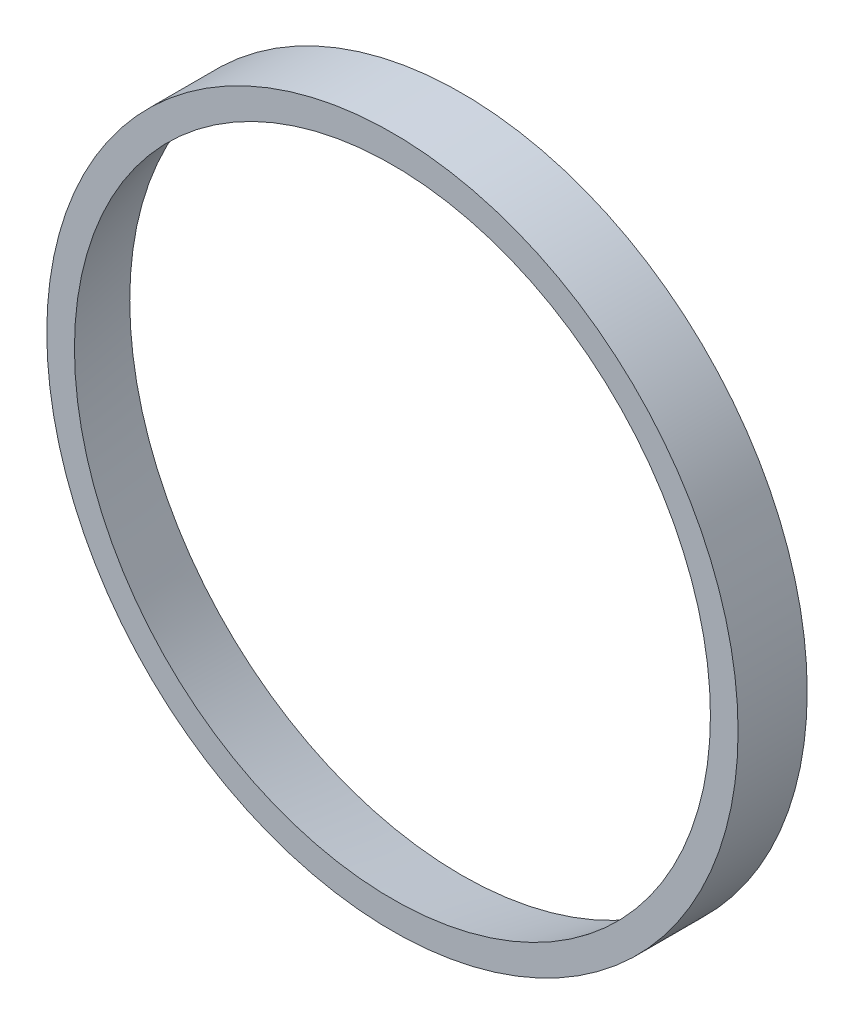
ISO-10303-21;
HEADER;
FILE_DESCRIPTION(('STEP AP214'),'2;1');
FILE_NAME('part.step','',(''),(''),'','','');
FILE_SCHEMA(('AUTOMOTIVE_DESIGN { 1 0 10303 214 1 1 1 1 }'));
ENDSEC;
DATA;
#1=APPLICATION_CONTEXT('core data for automotive mechanical design processes');
#2=APPLICATION_PROTOCOL_DEFINITION('international standard','automotive_design',2000,#1);
#3=PRODUCT_CONTEXT('',#1,'mechanical');
#4=PRODUCT('Part','Part','',(#3));
#5=PRODUCT_RELATED_PRODUCT_CATEGORY('part','',(#4));
#6=PRODUCT_DEFINITION_FORMATION('','',#4);
#7=PRODUCT_DEFINITION_CONTEXT('part definition',#1,'design');
#8=PRODUCT_DEFINITION('design','',#6,#7);
#9=PRODUCT_DEFINITION_SHAPE('','',#8);
#10=(LENGTH_UNIT() NAMED_UNIT(*) SI_UNIT(.MILLI.,.METRE.));
#11=(NAMED_UNIT(*) PLANE_ANGLE_UNIT() SI_UNIT($,.RADIAN.));
#12=(NAMED_UNIT(*) SI_UNIT($,.STERADIAN.) SOLID_ANGLE_UNIT());
#13=UNCERTAINTY_MEASURE_WITH_UNIT(LENGTH_MEASURE(1.E-05),#10,'distance_accuracy_value','');
#14=(GEOMETRIC_REPRESENTATION_CONTEXT(3) GLOBAL_UNCERTAINTY_ASSIGNED_CONTEXT((#13)) GLOBAL_UNIT_ASSIGNED_CONTEXT((#10,
#11,#12)) REPRESENTATION_CONTEXT('',''));
#15=CARTESIAN_POINT('',(0.,0.,0.));
#16=DIRECTION('',(0.,0.,1.));
#17=DIRECTION('',(1.,0.,0.));
#18=AXIS2_PLACEMENT_3D('',#15,#16,#17);
#19=CARTESIAN_POINT('',(14.605,0.,0.));
#20=DIRECTION('',(0.,0.,1.));
#21=DIRECTION('',(1.,0.,0.));
#22=AXIS2_PLACEMENT_3D('',#19,#20,#21);
#23=PLANE('',#22);
#24=CARTESIAN_POINT('',(0.,0.,0.));
#25=DIRECTION('',(0.,0.,1.));
#26=DIRECTION('',(1.,0.,0.));
#27=AXIS2_PLACEMENT_3D('',#24,#25,#26);
#28=CIRCLE('',#27,15.875);
#29=CARTESIAN_POINT('',(15.875,0.,0.));
#30=VERTEX_POINT('',#29);
#31=EDGE_CURVE('E10',#30,#30,#28,.T.);
#32=ORIENTED_EDGE('',*,*,#31,.T.);
#33=EDGE_LOOP('',(#32));
#34=FACE_BOUND('',#33,.T.);
#35=CARTESIAN_POINT('',(0.,0.,0.));
#36=DIRECTION('',(0.,0.,1.));
#37=DIRECTION('',(1.,0.,0.));
#38=AXIS2_PLACEMENT_3D('',#35,#36,#37);
#39=CIRCLE('',#38,14.605);
#40=CARTESIAN_POINT('',(14.605,0.,0.));
#41=VERTEX_POINT('',#40);
#42=EDGE_CURVE('E60',#41,#41,#39,.T.);
#43=ORIENTED_EDGE('',*,*,#42,.F.);
#44=EDGE_LOOP('',(#43));
#45=FACE_BOUND('',#44,.T.);
#46=ADVANCED_FACE('F43',(#34,#45),#23,.T.);
#47=CARTESIAN_POINT('',(0.,0.,0.));
#48=DIRECTION('',(0.,0.,1.));
#49=DIRECTION('',(1.,0.,0.));
#50=AXIS2_PLACEMENT_3D('',#47,#48,#49);
#51=CYLINDRICAL_SURFACE('',#50,15.875);
#52=CARTESIAN_POINT('',(0.,0.,-3.175));
#53=DIRECTION('',(0.,0.,1.));
#54=DIRECTION('',(1.,0.,0.));
#55=AXIS2_PLACEMENT_3D('',#52,#53,#54);
#56=CIRCLE('',#55,15.875);
#57=CARTESIAN_POINT('',(15.875,0.,-3.175));
#58=VERTEX_POINT('',#57);
#59=EDGE_CURVE('E50',#58,#58,#56,.T.);
#60=ORIENTED_EDGE('',*,*,#59,.T.);
#61=EDGE_LOOP('',(#60));
#62=FACE_BOUND('',#61,.T.);
#63=ORIENTED_EDGE('',*,*,#31,.F.);
#64=EDGE_LOOP('',(#63));
#65=FACE_BOUND('',#64,.T.);
#66=ADVANCED_FACE('F71',(#62,#65),#51,.T.);
#67=CARTESIAN_POINT('',(15.875,0.,-3.175));
#68=DIRECTION('',(0.,0.,-1.));
#69=DIRECTION('',(-1.,0.,0.));
#70=AXIS2_PLACEMENT_3D('',#67,#68,#69);
#71=PLANE('',#70);
#72=CARTESIAN_POINT('',(0.,0.,-3.175));
#73=DIRECTION('',(0.,0.,1.));
#74=DIRECTION('',(1.,0.,0.));
#75=AXIS2_PLACEMENT_3D('',#72,#73,#74);
#76=CIRCLE('',#75,15.24);
#77=CARTESIAN_POINT('',(15.24,0.,-3.175));
#78=VERTEX_POINT('',#77);
#79=EDGE_CURVE('E55',#78,#78,#76,.T.);
#80=ORIENTED_EDGE('',*,*,#79,.T.);
#81=EDGE_LOOP('',(#80));
#82=FACE_BOUND('',#81,.T.);
#83=ORIENTED_EDGE('',*,*,#59,.F.);
#84=EDGE_LOOP('',(#83));
#85=FACE_BOUND('',#84,.T.);
#86=ADVANCED_FACE('F75',(#82,#85),#71,.T.);
#87=CARTESIAN_POINT('',(0.,0.,-3.175));
#88=DIRECTION('',(0.,0.,-1.));
#89=DIRECTION('',(-1.,0.,0.));
#90=AXIS2_PLACEMENT_3D('',#87,#88,#89);
#91=CONICAL_SURFACE('',#90,15.24,0.197395559849881);
#92=ORIENTED_EDGE('',*,*,#42,.T.);
#93=EDGE_LOOP('',(#92));
#94=FACE_BOUND('',#93,.T.);
#95=ORIENTED_EDGE('',*,*,#79,.F.);
#96=EDGE_LOOP('',(#95));
#97=FACE_BOUND('',#96,.T.);
#98=ADVANCED_FACE('F67',(#94,#97),#91,.F.);
#99=CLOSED_SHELL('',(#46,#66,#86,#98));
#100=MANIFOLD_SOLID_BREP('B2',#99);
#101=ADVANCED_BREP_SHAPE_REPRESENTATION('',(#18,#100),#14);
#102=SHAPE_DEFINITION_REPRESENTATION(#9,#101);
ENDSEC;
END-ISO-10303-21;
